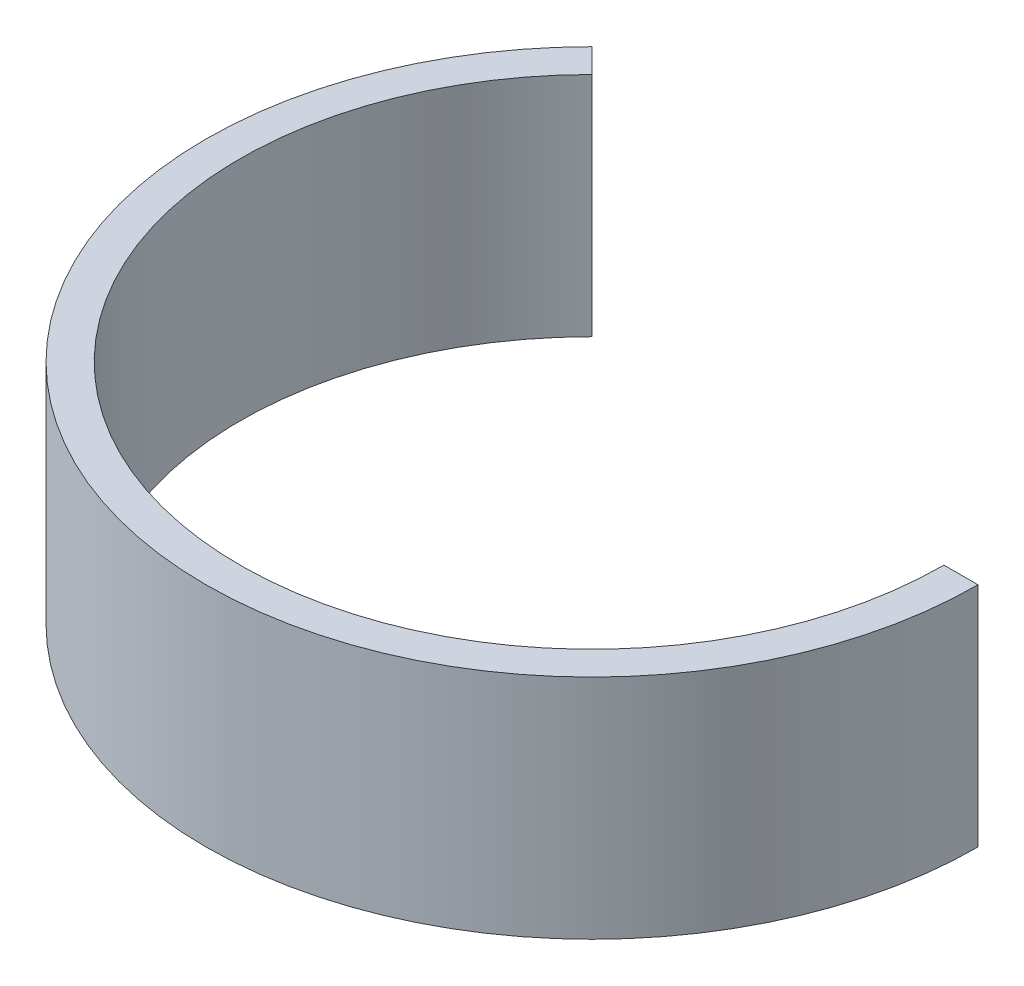
ISO-10303-21;
HEADER;
FILE_DESCRIPTION(('STEP AP214'),'2;1');
FILE_NAME('part.step','',(''),(''),'','','');
FILE_SCHEMA(('AUTOMOTIVE_DESIGN { 1 0 10303 214 1 1 1 1 }'));
ENDSEC;
DATA;
#1=APPLICATION_CONTEXT('core data for automotive mechanical design processes');
#2=APPLICATION_PROTOCOL_DEFINITION('international standard','automotive_design',2000,#1);
#3=PRODUCT_CONTEXT('',#1,'mechanical');
#4=PRODUCT('Part','Part','',(#3));
#5=PRODUCT_RELATED_PRODUCT_CATEGORY('part','',(#4));
#6=PRODUCT_DEFINITION_FORMATION('','',#4);
#7=PRODUCT_DEFINITION_CONTEXT('part definition',#1,'design');
#8=PRODUCT_DEFINITION('design','',#6,#7);
#9=PRODUCT_DEFINITION_SHAPE('','',#8);
#10=(LENGTH_UNIT() NAMED_UNIT(*) SI_UNIT(.MILLI.,.METRE.));
#11=(NAMED_UNIT(*) PLANE_ANGLE_UNIT() SI_UNIT($,.RADIAN.));
#12=(NAMED_UNIT(*) SI_UNIT($,.STERADIAN.) SOLID_ANGLE_UNIT());
#13=UNCERTAINTY_MEASURE_WITH_UNIT(LENGTH_MEASURE(1.E-05),#10,'distance_accuracy_value','');
#14=(GEOMETRIC_REPRESENTATION_CONTEXT(3) GLOBAL_UNCERTAINTY_ASSIGNED_CONTEXT((#13)) GLOBAL_UNIT_ASSIGNED_CONTEXT((#10,
#11,#12)) REPRESENTATION_CONTEXT('',''));
#15=CARTESIAN_POINT('',(0.,0.,0.));
#16=DIRECTION('',(0.,0.,1.));
#17=DIRECTION('',(1.,0.,0.));
#18=AXIS2_PLACEMENT_3D('',#15,#16,#17);
#19=CARTESIAN_POINT('',(-10.9601551083915,10.,-10.9601551083914));
#20=DIRECTION('',(-0.707106781186542,0.,0.707106781186553));
#21=DIRECTION('',(0.707106781186553,0.,0.707106781186542));
#22=AXIS2_PLACEMENT_3D('',#19,#20,#21);
#23=PLANE('',#22);
#24=DIRECTION('',(-0.707106781186553,0.,-0.707106781186542));
#25=VECTOR('',#24,1.);
#26=CARTESIAN_POINT('',(-10.9601551083915,0.,-10.9601551083914));
#27=LINE('',#26,#25);
#28=CARTESIAN_POINT('',(-10.9601551083915,0.,-10.9601551083914));
#29=VERTEX_POINT('',#28);
#30=CARTESIAN_POINT('',(-12.0208152801714,0.,-12.0208152801712));
#31=VERTEX_POINT('',#30);
#32=EDGE_CURVE('E96',#29,#31,#27,.T.);
#33=ORIENTED_EDGE('',*,*,#32,.T.);
#34=DIRECTION('',(0.,-1.,0.));
#35=VECTOR('',#34,1.);
#36=CARTESIAN_POINT('',(-12.0208152801714,10.,-12.0208152801712));
#37=LINE('',#36,#35);
#38=CARTESIAN_POINT('',(-12.0208152801714,10.,-12.0208152801712));
#39=VERTEX_POINT('',#38);
#40=EDGE_CURVE('E11',#39,#31,#37,.T.);
#41=ORIENTED_EDGE('',*,*,#40,.F.);
#42=DIRECTION('',(-0.707106781186553,0.,-0.707106781186542));
#43=VECTOR('',#42,1.);
#44=CARTESIAN_POINT('',(-10.9601551083915,10.,-10.9601551083914));
#45=LINE('',#44,#43);
#46=CARTESIAN_POINT('',(-10.9601551083915,10.,-10.9601551083914));
#47=VERTEX_POINT('',#46);
#48=EDGE_CURVE('E82',#47,#39,#45,.T.);
#49=ORIENTED_EDGE('',*,*,#48,.F.);
#50=DIRECTION('',(0.,-1.,0.));
#51=VECTOR('',#50,1.);
#52=CARTESIAN_POINT('',(-10.9601551083915,10.,-10.9601551083914));
#53=LINE('',#52,#51);
#54=EDGE_CURVE('E49',#47,#29,#53,.T.);
#55=ORIENTED_EDGE('',*,*,#54,.T.);
#56=EDGE_LOOP('',(#33,#41,#49,#55));
#57=FACE_BOUND('',#56,.T.);
#58=ADVANCED_FACE('F33',(#57),#23,.F.);
#59=CARTESIAN_POINT('',(0.,10.,0.));
#60=DIRECTION('',(0.,-1.,0.));
#61=DIRECTION('',(0.,0.,-1.));
#62=AXIS2_PLACEMENT_3D('',#59,#60,#61);
#63=CYLINDRICAL_SURFACE('',#62,17.);
#64=CARTESIAN_POINT('',(0.,0.,0.));
#65=DIRECTION('',(0.,1.,0.));
#66=DIRECTION('',(0.,0.,1.));
#67=AXIS2_PLACEMENT_3D('',#64,#65,#66);
#68=CIRCLE('',#67,17.);
#69=CARTESIAN_POINT('',(17.,0.,0.));
#70=VERTEX_POINT('',#69);
#71=EDGE_CURVE('E87',#31,#70,#68,.T.);
#72=ORIENTED_EDGE('',*,*,#71,.T.);
#73=DIRECTION('',(0.,-1.,0.));
#74=VECTOR('',#73,1.);
#75=CARTESIAN_POINT('',(17.,10.,0.));
#76=LINE('',#75,#74);
#77=CARTESIAN_POINT('',(17.,10.,0.));
#78=VERTEX_POINT('',#77);
#79=EDGE_CURVE('E41',#78,#70,#76,.T.);
#80=ORIENTED_EDGE('',*,*,#79,.F.);
#81=CARTESIAN_POINT('',(0.,10.,0.));
#82=DIRECTION('',(0.,1.,0.));
#83=DIRECTION('',(0.,0.,1.));
#84=AXIS2_PLACEMENT_3D('',#81,#82,#83);
#85=CIRCLE('',#84,17.);
#86=EDGE_CURVE('E74',#39,#78,#85,.T.);
#87=ORIENTED_EDGE('',*,*,#86,.F.);
#88=ORIENTED_EDGE('',*,*,#40,.T.);
#89=EDGE_LOOP('',(#72,#80,#87,#88));
#90=FACE_BOUND('',#89,.T.);
#91=ADVANCED_FACE('F86',(#90),#63,.T.);
#92=CARTESIAN_POINT('',(15.5,10.,0.));
#93=DIRECTION('',(0.,0.,-1.));
#94=DIRECTION('',(-1.,0.,0.));
#95=AXIS2_PLACEMENT_3D('',#92,#93,#94);
#96=PLANE('',#95);
#97=DIRECTION('',(1.,0.,0.));
#98=VECTOR('',#97,1.);
#99=CARTESIAN_POINT('',(15.5,0.,0.));
#100=LINE('',#99,#98);
#101=CARTESIAN_POINT('',(15.5,0.,0.));
#102=VERTEX_POINT('',#101);
#103=EDGE_CURVE('E99',#102,#70,#100,.T.);
#104=ORIENTED_EDGE('',*,*,#103,.F.);
#105=DIRECTION('',(0.,-1.,0.));
#106=VECTOR('',#105,1.);
#107=CARTESIAN_POINT('',(15.5,10.,0.));
#108=LINE('',#107,#106);
#109=CARTESIAN_POINT('',(15.5,10.,0.));
#110=VERTEX_POINT('',#109);
#111=EDGE_CURVE('E63',#110,#102,#108,.T.);
#112=ORIENTED_EDGE('',*,*,#111,.F.);
#113=DIRECTION('',(1.,0.,0.));
#114=VECTOR('',#113,1.);
#115=CARTESIAN_POINT('',(15.5,10.,0.));
#116=LINE('',#115,#114);
#117=EDGE_CURVE('E81',#110,#78,#116,.T.);
#118=ORIENTED_EDGE('',*,*,#117,.T.);
#119=ORIENTED_EDGE('',*,*,#79,.T.);
#120=EDGE_LOOP('',(#104,#112,#118,#119));
#121=FACE_BOUND('',#120,.T.);
#122=ADVANCED_FACE('F90',(#121),#96,.T.);
#123=CARTESIAN_POINT('',(0.,10.,0.));
#124=DIRECTION('',(0.,-1.,0.));
#125=DIRECTION('',(0.,0.,-1.));
#126=AXIS2_PLACEMENT_3D('',#123,#124,#125);
#127=CYLINDRICAL_SURFACE('',#126,15.5);
#128=CARTESIAN_POINT('',(0.,0.,0.));
#129=DIRECTION('',(0.,1.,0.));
#130=DIRECTION('',(0.,0.,1.));
#131=AXIS2_PLACEMENT_3D('',#128,#129,#130);
#132=CIRCLE('',#131,15.5);
#133=EDGE_CURVE('E101',#29,#102,#132,.T.);
#134=ORIENTED_EDGE('',*,*,#133,.F.);
#135=ORIENTED_EDGE('',*,*,#54,.F.);
#136=CARTESIAN_POINT('',(0.,10.,0.));
#137=DIRECTION('',(0.,1.,0.));
#138=DIRECTION('',(0.,0.,1.));
#139=AXIS2_PLACEMENT_3D('',#136,#137,#138);
#140=CIRCLE('',#139,15.5);
#141=EDGE_CURVE('E91',#47,#110,#140,.T.);
#142=ORIENTED_EDGE('',*,*,#141,.T.);
#143=ORIENTED_EDGE('',*,*,#111,.T.);
#144=EDGE_LOOP('',(#134,#135,#142,#143));
#145=FACE_BOUND('',#144,.T.);
#146=ADVANCED_FACE('F107',(#145),#127,.F.);
#147=CARTESIAN_POINT('',(0.,10.,0.));
#148=DIRECTION('',(0.,1.,0.));
#149=DIRECTION('',(0.,0.,1.));
#150=AXIS2_PLACEMENT_3D('',#147,#148,#149);
#151=PLANE('',#150);
#152=ORIENTED_EDGE('',*,*,#48,.T.);
#153=ORIENTED_EDGE('',*,*,#86,.T.);
#154=ORIENTED_EDGE('',*,*,#117,.F.);
#155=ORIENTED_EDGE('',*,*,#141,.F.);
#156=EDGE_LOOP('',(#152,#153,#154,#155));
#157=FACE_BOUND('',#156,.T.);
#158=ADVANCED_FACE('F78',(#157),#151,.T.);
#159=CARTESIAN_POINT('',(0.,0.,0.));
#160=DIRECTION('',(0.,1.,0.));
#161=DIRECTION('',(0.,0.,1.));
#162=AXIS2_PLACEMENT_3D('',#159,#160,#161);
#163=PLANE('',#162);
#164=ORIENTED_EDGE('',*,*,#32,.F.);
#165=ORIENTED_EDGE('',*,*,#133,.T.);
#166=ORIENTED_EDGE('',*,*,#103,.T.);
#167=ORIENTED_EDGE('',*,*,#71,.F.);
#168=EDGE_LOOP('',(#164,#165,#166,#167));
#169=FACE_BOUND('',#168,.T.);
#170=ADVANCED_FACE('F106',(#169),#163,.F.);
#171=CLOSED_SHELL('',(#58,#91,#122,#146,#158,#170));
#172=MANIFOLD_SOLID_BREP('B2',#171);
#173=ADVANCED_BREP_SHAPE_REPRESENTATION('',(#18,#172),#14);
#174=SHAPE_DEFINITION_REPRESENTATION(#9,#173);
ENDSEC;
END-ISO-10303-21;
